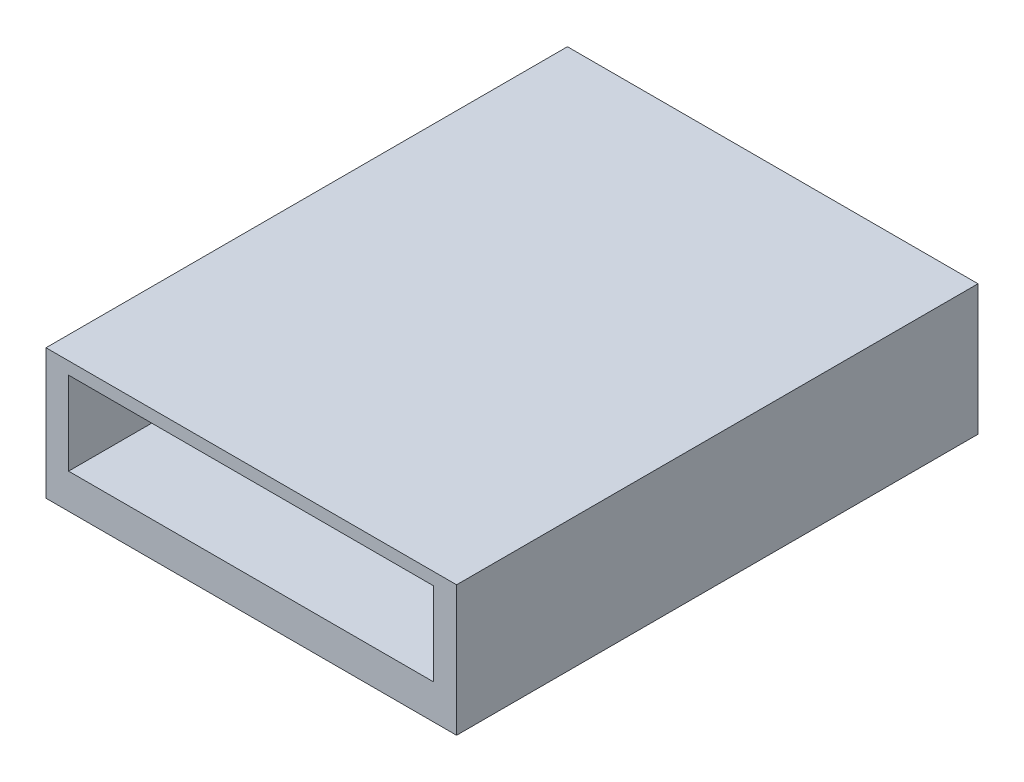
ISO-10303-21;
HEADER;
FILE_DESCRIPTION(('STEP AP214'),'2;1');
FILE_NAME('part.step','',(''),(''),'','','');
FILE_SCHEMA(('AUTOMOTIVE_DESIGN { 1 0 10303 214 1 1 1 1 }'));
ENDSEC;
DATA;
#1=APPLICATION_CONTEXT('core data for automotive mechanical design processes');
#2=APPLICATION_PROTOCOL_DEFINITION('international standard','automotive_design',2000,#1);
#3=PRODUCT_CONTEXT('',#1,'mechanical');
#4=PRODUCT('Part','Part','',(#3));
#5=PRODUCT_RELATED_PRODUCT_CATEGORY('part','',(#4));
#6=PRODUCT_DEFINITION_FORMATION('','',#4);
#7=PRODUCT_DEFINITION_CONTEXT('part definition',#1,'design');
#8=PRODUCT_DEFINITION('design','',#6,#7);
#9=PRODUCT_DEFINITION_SHAPE('','',#8);
#10=(LENGTH_UNIT() NAMED_UNIT(*) SI_UNIT(.MILLI.,.METRE.));
#11=(NAMED_UNIT(*) PLANE_ANGLE_UNIT() SI_UNIT($,.RADIAN.));
#12=(NAMED_UNIT(*) SI_UNIT($,.STERADIAN.) SOLID_ANGLE_UNIT());
#13=UNCERTAINTY_MEASURE_WITH_UNIT(LENGTH_MEASURE(1.E-05),#10,'distance_accuracy_value','');
#14=(GEOMETRIC_REPRESENTATION_CONTEXT(3) GLOBAL_UNCERTAINTY_ASSIGNED_CONTEXT((#13)) GLOBAL_UNIT_ASSIGNED_CONTEXT((#10,
#11,#12)) REPRESENTATION_CONTEXT('',''));
#15=CARTESIAN_POINT('',(0.,0.,0.));
#16=DIRECTION('',(0.,0.,1.));
#17=DIRECTION('',(1.,0.,0.));
#18=AXIS2_PLACEMENT_3D('',#15,#16,#17);
#19=CARTESIAN_POINT('',(0.,0.,-15.24));
#20=DIRECTION('',(-1.,0.,0.));
#21=DIRECTION('',(0.,-1.,0.));
#22=AXIS2_PLACEMENT_3D('',#19,#20,#21);
#23=PLANE('',#22);
#24=DIRECTION('',(0.,-1.,0.));
#25=VECTOR('',#24,1.);
#26=CARTESIAN_POINT('',(0.,0.,0.));
#27=LINE('',#26,#25);
#28=CARTESIAN_POINT('',(0.,3.81,0.));
#29=VERTEX_POINT('',#28);
#30=CARTESIAN_POINT('',(0.,0.,0.));
#31=VERTEX_POINT('',#30);
#32=EDGE_CURVE('E140',#29,#31,#27,.T.);
#33=ORIENTED_EDGE('',*,*,#32,.F.);
#34=DIRECTION('',(0.,0.,1.));
#35=VECTOR('',#34,1.);
#36=CARTESIAN_POINT('',(0.,3.81,-15.24));
#37=LINE('',#36,#35);
#38=CARTESIAN_POINT('',(0.,3.81,-15.24));
#39=VERTEX_POINT('',#38);
#40=EDGE_CURVE('E11',#39,#29,#37,.T.);
#41=ORIENTED_EDGE('',*,*,#40,.F.);
#42=DIRECTION('',(0.,-1.,0.));
#43=VECTOR('',#42,1.);
#44=CARTESIAN_POINT('',(0.,0.,-15.24));
#45=LINE('',#44,#43);
#46=CARTESIAN_POINT('',(0.,0.,-15.24));
#47=VERTEX_POINT('',#46);
#48=EDGE_CURVE('E144',#39,#47,#45,.T.);
#49=ORIENTED_EDGE('',*,*,#48,.T.);
#50=DIRECTION('',(0.,0.,1.));
#51=VECTOR('',#50,1.);
#52=CARTESIAN_POINT('',(0.,0.,-15.24));
#53=LINE('',#52,#51);
#54=EDGE_CURVE('E36',#47,#31,#53,.T.);
#55=ORIENTED_EDGE('',*,*,#54,.T.);
#56=EDGE_LOOP('',(#33,#41,#49,#55));
#57=FACE_BOUND('',#56,.T.);
#58=ADVANCED_FACE('F33',(#57),#23,.T.);
#59=CARTESIAN_POINT('',(0.,3.81,-15.24));
#60=DIRECTION('',(0.,1.,0.));
#61=DIRECTION('',(0.,0.,1.));
#62=AXIS2_PLACEMENT_3D('',#59,#60,#61);
#63=PLANE('',#62);
#64=DIRECTION('',(-1.,0.,0.));
#65=VECTOR('',#64,1.);
#66=CARTESIAN_POINT('',(0.,3.81,0.));
#67=LINE('',#66,#65);
#68=CARTESIAN_POINT('',(12.,3.81,0.));
#69=VERTEX_POINT('',#68);
#70=EDGE_CURVE('E147',#69,#29,#67,.T.);
#71=ORIENTED_EDGE('',*,*,#70,.F.);
#72=DIRECTION('',(0.,0.,1.));
#73=VECTOR('',#72,1.);
#74=CARTESIAN_POINT('',(12.,3.81,-15.24));
#75=LINE('',#74,#73);
#76=CARTESIAN_POINT('',(12.,3.81,-15.24));
#77=VERTEX_POINT('',#76);
#78=EDGE_CURVE('E41',#77,#69,#75,.T.);
#79=ORIENTED_EDGE('',*,*,#78,.F.);
#80=DIRECTION('',(-1.,0.,0.));
#81=VECTOR('',#80,1.);
#82=CARTESIAN_POINT('',(0.,3.81,-15.24));
#83=LINE('',#82,#81);
#84=EDGE_CURVE('E152',#77,#39,#83,.T.);
#85=ORIENTED_EDGE('',*,*,#84,.T.);
#86=ORIENTED_EDGE('',*,*,#40,.T.);
#87=EDGE_LOOP('',(#71,#79,#85,#86));
#88=FACE_BOUND('',#87,.T.);
#89=ADVANCED_FACE('F169',(#88),#63,.T.);
#90=CARTESIAN_POINT('',(12.,0.,-15.24));
#91=DIRECTION('',(1.,0.,0.));
#92=DIRECTION('',(0.,1.,0.));
#93=AXIS2_PLACEMENT_3D('',#90,#91,#92);
#94=PLANE('',#93);
#95=DIRECTION('',(0.,1.,0.));
#96=VECTOR('',#95,1.);
#97=CARTESIAN_POINT('',(12.,0.,0.));
#98=LINE('',#97,#96);
#99=CARTESIAN_POINT('',(12.,0.,0.));
#100=VERTEX_POINT('',#99);
#101=EDGE_CURVE('E159',#100,#69,#98,.T.);
#102=ORIENTED_EDGE('',*,*,#101,.F.);
#103=DIRECTION('',(0.,0.,1.));
#104=VECTOR('',#103,1.);
#105=CARTESIAN_POINT('',(12.,0.,-15.24));
#106=LINE('',#105,#104);
#107=CARTESIAN_POINT('',(12.,0.,-15.24));
#108=VERTEX_POINT('',#107);
#109=EDGE_CURVE('E164',#108,#100,#106,.T.);
#110=ORIENTED_EDGE('',*,*,#109,.F.);
#111=DIRECTION('',(0.,1.,0.));
#112=VECTOR('',#111,1.);
#113=CARTESIAN_POINT('',(12.,0.,-15.24));
#114=LINE('',#113,#112);
#115=EDGE_CURVE('E149',#108,#77,#114,.T.);
#116=ORIENTED_EDGE('',*,*,#115,.T.);
#117=ORIENTED_EDGE('',*,*,#78,.T.);
#118=EDGE_LOOP('',(#102,#110,#116,#117));
#119=FACE_BOUND('',#118,.T.);
#120=ADVANCED_FACE('F173',(#119),#94,.T.);
#121=CARTESIAN_POINT('',(0.,0.,-15.24));
#122=DIRECTION('',(0.,-1.,0.));
#123=DIRECTION('',(0.,0.,-1.));
#124=AXIS2_PLACEMENT_3D('',#121,#122,#123);
#125=PLANE('',#124);
#126=DIRECTION('',(1.,0.,0.));
#127=VECTOR('',#126,1.);
#128=CARTESIAN_POINT('',(0.,0.,0.));
#129=LINE('',#128,#127);
#130=EDGE_CURVE('E156',#31,#100,#129,.T.);
#131=ORIENTED_EDGE('',*,*,#130,.F.);
#132=ORIENTED_EDGE('',*,*,#54,.F.);
#133=DIRECTION('',(1.,0.,0.));
#134=VECTOR('',#133,1.);
#135=CARTESIAN_POINT('',(0.,0.,-15.24));
#136=LINE('',#135,#134);
#137=EDGE_CURVE('E146',#47,#108,#136,.T.);
#138=ORIENTED_EDGE('',*,*,#137,.T.);
#139=ORIENTED_EDGE('',*,*,#109,.T.);
#140=EDGE_LOOP('',(#131,#132,#138,#139));
#141=FACE_BOUND('',#140,.T.);
#142=ADVANCED_FACE('F166',(#141),#125,.T.);
#143=CARTESIAN_POINT('',(0.,3.81,-15.24));
#144=DIRECTION('',(0.,0.,-1.));
#145=DIRECTION('',(-1.,0.,0.));
#146=AXIS2_PLACEMENT_3D('',#143,#144,#145);
#147=PLANE('',#146);
#148=ORIENTED_EDGE('',*,*,#48,.F.);
#149=ORIENTED_EDGE('',*,*,#84,.F.);
#150=ORIENTED_EDGE('',*,*,#115,.F.);
#151=ORIENTED_EDGE('',*,*,#137,.F.);
#152=EDGE_LOOP('',(#148,#149,#150,#151));
#153=FACE_BOUND('',#152,.T.);
#154=ADVANCED_FACE('F175',(#153),#147,.T.);
#155=CARTESIAN_POINT('',(0.,3.81,0.));
#156=DIRECTION('',(0.,0.,-1.));
#157=DIRECTION('',(-1.,0.,0.));
#158=AXIS2_PLACEMENT_3D('',#155,#156,#157);
#159=PLANE('',#158);
#160=DIRECTION('',(1.,0.,0.));
#161=VECTOR('',#160,1.);
#162=CARTESIAN_POINT('',(0.660399999999999,1.016,0.));
#163=LINE('',#162,#161);
#164=CARTESIAN_POINT('',(0.660399999999999,1.016,0.));
#165=VERTEX_POINT('',#164);
#166=CARTESIAN_POINT('',(11.3284,1.016,0.));
#167=VERTEX_POINT('',#166);
#168=EDGE_CURVE('E134',#165,#167,#163,.T.);
#169=ORIENTED_EDGE('',*,*,#168,.F.);
#170=DIRECTION('',(0.,-1.,0.));
#171=VECTOR('',#170,1.);
#172=CARTESIAN_POINT('',(0.660399999999998,3.44699226773411,0.));
#173=LINE('',#172,#171);
#174=CARTESIAN_POINT('',(0.660399999999998,3.44699226773411,0.));
#175=VERTEX_POINT('',#174);
#176=EDGE_CURVE('E49',#175,#165,#173,.T.);
#177=ORIENTED_EDGE('',*,*,#176,.F.);
#178=DIRECTION('',(-1.,0.,0.));
#179=VECTOR('',#178,1.);
#180=CARTESIAN_POINT('',(0.660399999999998,3.44699226773411,0.));
#181=LINE('',#180,#179);
#182=CARTESIAN_POINT('',(11.3284,3.44699226773411,0.));
#183=VERTEX_POINT('',#182);
#184=EDGE_CURVE('E125',#183,#175,#181,.T.);
#185=ORIENTED_EDGE('',*,*,#184,.F.);
#186=DIRECTION('',(0.,1.,0.));
#187=VECTOR('',#186,1.);
#188=CARTESIAN_POINT('',(11.3284,3.44699226773411,0.));
#189=LINE('',#188,#187);
#190=EDGE_CURVE('E128',#167,#183,#189,.T.);
#191=ORIENTED_EDGE('',*,*,#190,.F.);
#192=EDGE_LOOP('',(#169,#177,#185,#191));
#193=FACE_BOUND('',#192,.T.);
#194=ORIENTED_EDGE('',*,*,#32,.T.);
#195=ORIENTED_EDGE('',*,*,#130,.T.);
#196=ORIENTED_EDGE('',*,*,#101,.T.);
#197=ORIENTED_EDGE('',*,*,#70,.T.);
#198=EDGE_LOOP('',(#194,#195,#196,#197));
#199=FACE_BOUND('',#198,.T.);
#200=ADVANCED_FACE('F168',(#193,#199),#159,.F.);
#201=CARTESIAN_POINT('',(0.660399999999998,3.44699226773411,-12.7));
#202=DIRECTION('',(-1.,0.,0.));
#203=DIRECTION('',(0.,-1.,0.));
#204=AXIS2_PLACEMENT_3D('',#201,#202,#203);
#205=PLANE('',#204);
#206=ORIENTED_EDGE('',*,*,#176,.T.);
#207=DIRECTION('',(0.,0.,1.));
#208=VECTOR('',#207,1.);
#209=CARTESIAN_POINT('',(0.660399999999999,1.016,-12.7));
#210=LINE('',#209,#208);
#211=CARTESIAN_POINT('',(0.660399999999999,1.016,-12.7));
#212=VERTEX_POINT('',#211);
#213=EDGE_CURVE('E103',#212,#165,#210,.T.);
#214=ORIENTED_EDGE('',*,*,#213,.F.);
#215=DIRECTION('',(0.,-1.,0.));
#216=VECTOR('',#215,1.);
#217=CARTESIAN_POINT('',(0.660399999999998,3.44699226773411,-12.7));
#218=LINE('',#217,#216);
#219=CARTESIAN_POINT('',(0.660399999999998,3.44699226773411,-12.7));
#220=VERTEX_POINT('',#219);
#221=EDGE_CURVE('E107',#220,#212,#218,.T.);
#222=ORIENTED_EDGE('',*,*,#221,.F.);
#223=DIRECTION('',(0.,0.,1.));
#224=VECTOR('',#223,1.);
#225=CARTESIAN_POINT('',(0.660399999999998,3.44699226773411,-12.7));
#226=LINE('',#225,#224);
#227=EDGE_CURVE('E138',#220,#175,#226,.T.);
#228=ORIENTED_EDGE('',*,*,#227,.T.);
#229=EDGE_LOOP('',(#206,#214,#222,#228));
#230=FACE_BOUND('',#229,.T.);
#231=ADVANCED_FACE('F105',(#230),#205,.F.);
#232=CARTESIAN_POINT('',(0.660399999999998,3.44699226773411,-12.7));
#233=DIRECTION('',(0.,1.,0.));
#234=DIRECTION('',(-1.,0.,0.));
#235=AXIS2_PLACEMENT_3D('',#232,#233,#234);
#236=PLANE('',#235);
#237=ORIENTED_EDGE('',*,*,#184,.T.);
#238=ORIENTED_EDGE('',*,*,#227,.F.);
#239=DIRECTION('',(-1.,0.,0.));
#240=VECTOR('',#239,1.);
#241=CARTESIAN_POINT('',(0.660399999999998,3.44699226773411,-12.7));
#242=LINE('',#241,#240);
#243=CARTESIAN_POINT('',(11.3284,3.44699226773411,-12.7));
#244=VERTEX_POINT('',#243);
#245=EDGE_CURVE('E113',#244,#220,#242,.T.);
#246=ORIENTED_EDGE('',*,*,#245,.F.);
#247=DIRECTION('',(0.,0.,1.));
#248=VECTOR('',#247,1.);
#249=CARTESIAN_POINT('',(11.3284,3.44699226773411,-12.7));
#250=LINE('',#249,#248);
#251=EDGE_CURVE('E141',#244,#183,#250,.T.);
#252=ORIENTED_EDGE('',*,*,#251,.T.);
#253=EDGE_LOOP('',(#237,#238,#246,#252));
#254=FACE_BOUND('',#253,.T.);
#255=ADVANCED_FACE('F219',(#254),#236,.F.);
#256=CARTESIAN_POINT('',(11.3284,3.44699226773411,-12.7));
#257=DIRECTION('',(1.,0.,0.));
#258=DIRECTION('',(0.,0.,-1.));
#259=AXIS2_PLACEMENT_3D('',#256,#257,#258);
#260=PLANE('',#259);
#261=ORIENTED_EDGE('',*,*,#190,.T.);
#262=ORIENTED_EDGE('',*,*,#251,.F.);
#263=DIRECTION('',(0.,1.,0.));
#264=VECTOR('',#263,1.);
#265=CARTESIAN_POINT('',(11.3284,3.44699226773411,-12.7));
#266=LINE('',#265,#264);
#267=CARTESIAN_POINT('',(11.3284,1.016,-12.7));
#268=VERTEX_POINT('',#267);
#269=EDGE_CURVE('E121',#268,#244,#266,.T.);
#270=ORIENTED_EDGE('',*,*,#269,.F.);
#271=DIRECTION('',(0.,0.,1.));
#272=VECTOR('',#271,1.);
#273=CARTESIAN_POINT('',(11.3284,1.016,-12.7));
#274=LINE('',#273,#272);
#275=EDGE_CURVE('E112',#268,#167,#274,.T.);
#276=ORIENTED_EDGE('',*,*,#275,.T.);
#277=EDGE_LOOP('',(#261,#262,#270,#276));
#278=FACE_BOUND('',#277,.T.);
#279=ADVANCED_FACE('F227',(#278),#260,.F.);
#280=CARTESIAN_POINT('',(0.660399999999999,1.016,-12.7));
#281=DIRECTION('',(0.,-1.,0.));
#282=DIRECTION('',(0.,0.,-1.));
#283=AXIS2_PLACEMENT_3D('',#280,#281,#282);
#284=PLANE('',#283);
#285=ORIENTED_EDGE('',*,*,#168,.T.);
#286=ORIENTED_EDGE('',*,*,#275,.F.);
#287=DIRECTION('',(1.,0.,0.));
#288=VECTOR('',#287,1.);
#289=CARTESIAN_POINT('',(0.660399999999999,1.016,-12.7));
#290=LINE('',#289,#288);
#291=EDGE_CURVE('E116',#212,#268,#290,.T.);
#292=ORIENTED_EDGE('',*,*,#291,.F.);
#293=ORIENTED_EDGE('',*,*,#213,.T.);
#294=EDGE_LOOP('',(#285,#286,#292,#293));
#295=FACE_BOUND('',#294,.T.);
#296=ADVANCED_FACE('F117',(#295),#284,.F.);
#297=CARTESIAN_POINT('',(0.660399999999999,1.016,-12.7));
#298=DIRECTION('',(0.,0.,1.));
#299=DIRECTION('',(1.,0.,0.));
#300=AXIS2_PLACEMENT_3D('',#297,#298,#299);
#301=PLANE('',#300);
#302=ORIENTED_EDGE('',*,*,#221,.T.);
#303=ORIENTED_EDGE('',*,*,#291,.T.);
#304=ORIENTED_EDGE('',*,*,#269,.T.);
#305=ORIENTED_EDGE('',*,*,#245,.T.);
#306=EDGE_LOOP('',(#302,#303,#304,#305));
#307=FACE_BOUND('',#306,.T.);
#308=ADVANCED_FACE('F123',(#307),#301,.T.);
#309=CLOSED_SHELL('',(#58,#89,#120,#142,#154,#200,#231,#255,#279,#296,#308));
#310=MANIFOLD_SOLID_BREP('B2',#309);
#311=ADVANCED_BREP_SHAPE_REPRESENTATION('',(#18,#310),#14);
#312=SHAPE_DEFINITION_REPRESENTATION(#9,#311);
ENDSEC;
END-ISO-10303-21;
